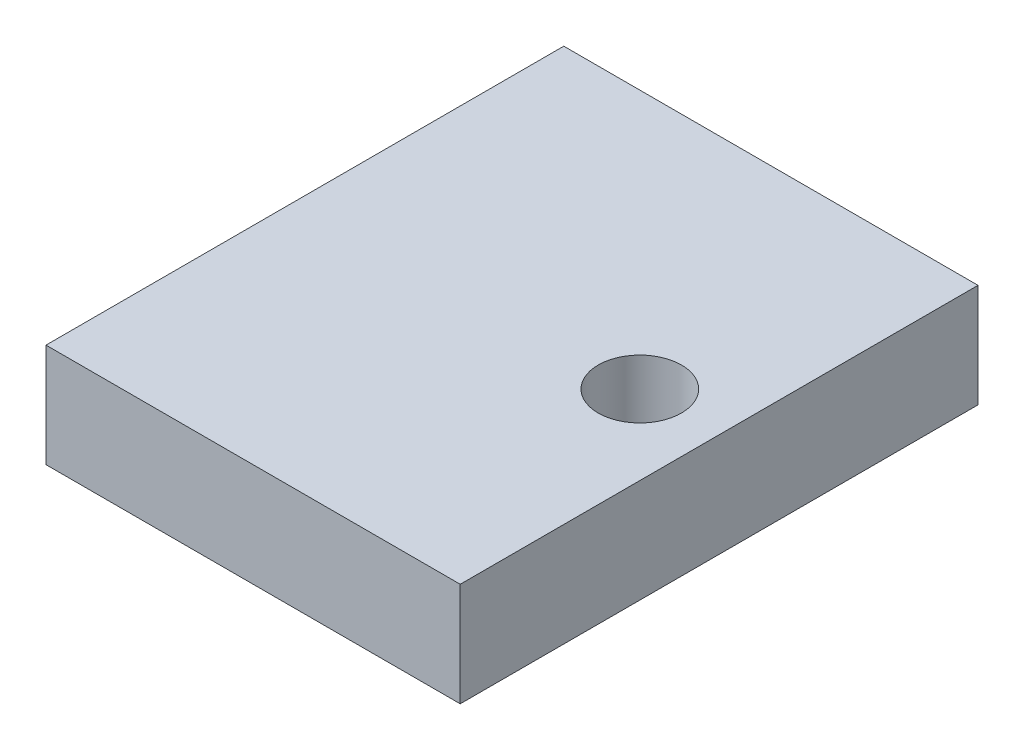
ISO-10303-21;
HEADER;
FILE_DESCRIPTION(('STEP AP214'),'2;1');
FILE_NAME('part.step','',(''),(''),'','','');
FILE_SCHEMA(('AUTOMOTIVE_DESIGN { 1 0 10303 214 1 1 1 1 }'));
ENDSEC;
DATA;
#1=APPLICATION_CONTEXT('core data for automotive mechanical design processes');
#2=APPLICATION_PROTOCOL_DEFINITION('international standard','automotive_design',2000,#1);
#3=PRODUCT_CONTEXT('',#1,'mechanical');
#4=PRODUCT('Part','Part','',(#3));
#5=PRODUCT_RELATED_PRODUCT_CATEGORY('part','',(#4));
#6=PRODUCT_DEFINITION_FORMATION('','',#4);
#7=PRODUCT_DEFINITION_CONTEXT('part definition',#1,'design');
#8=PRODUCT_DEFINITION('design','',#6,#7);
#9=PRODUCT_DEFINITION_SHAPE('','',#8);
#10=(LENGTH_UNIT() NAMED_UNIT(*) SI_UNIT(.MILLI.,.METRE.));
#11=(NAMED_UNIT(*) PLANE_ANGLE_UNIT() SI_UNIT($,.RADIAN.));
#12=(NAMED_UNIT(*) SI_UNIT($,.STERADIAN.) SOLID_ANGLE_UNIT());
#13=UNCERTAINTY_MEASURE_WITH_UNIT(LENGTH_MEASURE(1.E-05),#10,'distance_accuracy_value','');
#14=(GEOMETRIC_REPRESENTATION_CONTEXT(3) GLOBAL_UNCERTAINTY_ASSIGNED_CONTEXT((#13)) GLOBAL_UNIT_ASSIGNED_CONTEXT((#10,
#11,#12)) REPRESENTATION_CONTEXT('',''));
#15=CARTESIAN_POINT('',(0.,0.,0.));
#16=DIRECTION('',(0.,0.,1.));
#17=DIRECTION('',(1.,0.,0.));
#18=AXIS2_PLACEMENT_3D('',#15,#16,#17);
#19=CARTESIAN_POINT('',(25.4,6.35,0.));
#20=DIRECTION('',(1.,0.,0.));
#21=DIRECTION('',(0.,0.,-1.));
#22=AXIS2_PLACEMENT_3D('',#19,#20,#21);
#23=PLANE('',#22);
#24=DIRECTION('',(0.,0.,1.));
#25=VECTOR('',#24,1.);
#26=CARTESIAN_POINT('',(25.4,0.,0.));
#27=LINE('',#26,#25);
#28=CARTESIAN_POINT('',(25.4,0.,-31.75));
#29=VERTEX_POINT('',#28);
#30=CARTESIAN_POINT('',(25.4,0.,0.));
#31=VERTEX_POINT('',#30);
#32=EDGE_CURVE('E101',#29,#31,#27,.T.);
#33=ORIENTED_EDGE('',*,*,#32,.F.);
#34=DIRECTION('',(0.,-1.,0.));
#35=VECTOR('',#34,1.);
#36=CARTESIAN_POINT('',(25.4,6.35,-31.75));
#37=LINE('',#36,#35);
#38=CARTESIAN_POINT('',(25.4,6.35,-31.75));
#39=VERTEX_POINT('',#38);
#40=EDGE_CURVE('E11',#39,#29,#37,.T.);
#41=ORIENTED_EDGE('',*,*,#40,.F.);
#42=DIRECTION('',(0.,0.,1.));
#43=VECTOR('',#42,1.);
#44=CARTESIAN_POINT('',(25.4,6.35,0.));
#45=LINE('',#44,#43);
#46=CARTESIAN_POINT('',(25.4,6.35,0.));
#47=VERTEX_POINT('',#46);
#48=EDGE_CURVE('E94',#39,#47,#45,.T.);
#49=ORIENTED_EDGE('',*,*,#48,.T.);
#50=DIRECTION('',(0.,-1.,0.));
#51=VECTOR('',#50,1.);
#52=CARTESIAN_POINT('',(25.4,6.35,0.));
#53=LINE('',#52,#51);
#54=EDGE_CURVE('E75',#47,#31,#53,.T.);
#55=ORIENTED_EDGE('',*,*,#54,.T.);
#56=EDGE_LOOP('',(#33,#41,#49,#55));
#57=FACE_BOUND('',#56,.T.);
#58=ADVANCED_FACE('F36',(#57),#23,.T.);
#59=CARTESIAN_POINT('',(0.,6.35,-31.75));
#60=DIRECTION('',(0.,0.,-1.));
#61=DIRECTION('',(-1.,0.,0.));
#62=AXIS2_PLACEMENT_3D('',#59,#60,#61);
#63=PLANE('',#62);
#64=DIRECTION('',(1.,0.,0.));
#65=VECTOR('',#64,1.);
#66=CARTESIAN_POINT('',(0.,0.,-31.75));
#67=LINE('',#66,#65);
#68=CARTESIAN_POINT('',(0.,0.,-31.75));
#69=VERTEX_POINT('',#68);
#70=EDGE_CURVE('E86',#69,#29,#67,.T.);
#71=ORIENTED_EDGE('',*,*,#70,.F.);
#72=DIRECTION('',(0.,-1.,0.));
#73=VECTOR('',#72,1.);
#74=CARTESIAN_POINT('',(0.,6.35,-31.75));
#75=LINE('',#74,#73);
#76=CARTESIAN_POINT('',(0.,6.35,-31.75));
#77=VERTEX_POINT('',#76);
#78=EDGE_CURVE('E45',#77,#69,#75,.T.);
#79=ORIENTED_EDGE('',*,*,#78,.F.);
#80=DIRECTION('',(1.,0.,0.));
#81=VECTOR('',#80,1.);
#82=CARTESIAN_POINT('',(0.,6.35,-31.75));
#83=LINE('',#82,#81);
#84=EDGE_CURVE('E84',#77,#39,#83,.T.);
#85=ORIENTED_EDGE('',*,*,#84,.T.);
#86=ORIENTED_EDGE('',*,*,#40,.T.);
#87=EDGE_LOOP('',(#71,#79,#85,#86));
#88=FACE_BOUND('',#87,.T.);
#89=ADVANCED_FACE('F83',(#88),#63,.T.);
#90=CARTESIAN_POINT('',(0.,6.35,0.));
#91=DIRECTION('',(-1.,0.,0.));
#92=DIRECTION('',(0.,0.,1.));
#93=AXIS2_PLACEMENT_3D('',#90,#91,#92);
#94=PLANE('',#93);
#95=DIRECTION('',(0.,0.,-1.));
#96=VECTOR('',#95,1.);
#97=CARTESIAN_POINT('',(0.,0.,0.));
#98=LINE('',#97,#96);
#99=CARTESIAN_POINT('',(0.,0.,0.));
#100=VERTEX_POINT('',#99);
#101=EDGE_CURVE('E105',#100,#69,#98,.T.);
#102=ORIENTED_EDGE('',*,*,#101,.F.);
#103=DIRECTION('',(0.,-1.,0.));
#104=VECTOR('',#103,1.);
#105=CARTESIAN_POINT('',(0.,6.35,0.));
#106=LINE('',#105,#104);
#107=CARTESIAN_POINT('',(0.,6.35,0.));
#108=VERTEX_POINT('',#107);
#109=EDGE_CURVE('E68',#108,#100,#106,.T.);
#110=ORIENTED_EDGE('',*,*,#109,.F.);
#111=DIRECTION('',(0.,0.,-1.));
#112=VECTOR('',#111,1.);
#113=CARTESIAN_POINT('',(0.,6.35,0.));
#114=LINE('',#113,#112);
#115=EDGE_CURVE('E93',#108,#77,#114,.T.);
#116=ORIENTED_EDGE('',*,*,#115,.T.);
#117=ORIENTED_EDGE('',*,*,#78,.T.);
#118=EDGE_LOOP('',(#102,#110,#116,#117));
#119=FACE_BOUND('',#118,.T.);
#120=ADVANCED_FACE('F96',(#119),#94,.T.);
#121=CARTESIAN_POINT('',(0.,6.35,0.));
#122=DIRECTION('',(0.,0.,-1.));
#123=DIRECTION('',(-1.,0.,0.));
#124=AXIS2_PLACEMENT_3D('',#121,#122,#123);
#125=PLANE('',#124);
#126=DIRECTION('',(1.,0.,0.));
#127=VECTOR('',#126,1.);
#128=CARTESIAN_POINT('',(0.,0.,0.));
#129=LINE('',#128,#127);
#130=EDGE_CURVE('E107',#100,#31,#129,.T.);
#131=ORIENTED_EDGE('',*,*,#130,.T.);
#132=ORIENTED_EDGE('',*,*,#54,.F.);
#133=DIRECTION('',(1.,0.,0.));
#134=VECTOR('',#133,1.);
#135=CARTESIAN_POINT('',(0.,6.35,0.));
#136=LINE('',#135,#134);
#137=EDGE_CURVE('E53',#108,#47,#136,.T.);
#138=ORIENTED_EDGE('',*,*,#137,.F.);
#139=ORIENTED_EDGE('',*,*,#109,.T.);
#140=EDGE_LOOP('',(#131,#132,#138,#139));
#141=FACE_BOUND('',#140,.T.);
#142=ADVANCED_FACE('F137',(#141),#125,.F.);
#143=CARTESIAN_POINT('',(0.,6.35,0.));
#144=DIRECTION('',(0.,1.,0.));
#145=DIRECTION('',(0.,0.,1.));
#146=AXIS2_PLACEMENT_3D('',#143,#144,#145);
#147=PLANE('',#146);
#148=CARTESIAN_POINT('',(20.539202,6.35,-15.875));
#149=DIRECTION('',(0.,1.,0.));
#150=DIRECTION('',(0.,0.,1.));
#151=AXIS2_PLACEMENT_3D('',#148,#149,#150);
#152=CIRCLE('',#151,2.55269999999999);
#153=CARTESIAN_POINT('',(20.539202,6.35,-13.3223));
#154=VERTEX_POINT('',#153);
#155=EDGE_CURVE('E111',#154,#154,#152,.T.);
#156=ORIENTED_EDGE('',*,*,#155,.F.);
#157=EDGE_LOOP('',(#156));
#158=FACE_BOUND('',#157,.T.);
#159=ORIENTED_EDGE('',*,*,#48,.F.);
#160=ORIENTED_EDGE('',*,*,#84,.F.);
#161=ORIENTED_EDGE('',*,*,#115,.F.);
#162=ORIENTED_EDGE('',*,*,#137,.T.);
#163=EDGE_LOOP('',(#159,#160,#161,#162));
#164=FACE_BOUND('',#163,.T.);
#165=ADVANCED_FACE('F92',(#158,#164),#147,.T.);
#166=CARTESIAN_POINT('',(0.,0.,0.));
#167=DIRECTION('',(0.,1.,0.));
#168=DIRECTION('',(0.,0.,1.));
#169=AXIS2_PLACEMENT_3D('',#166,#167,#168);
#170=PLANE('',#169);
#171=CARTESIAN_POINT('',(20.539202,0.,-15.875));
#172=DIRECTION('',(0.,1.,0.));
#173=DIRECTION('',(0.,0.,1.));
#174=AXIS2_PLACEMENT_3D('',#171,#172,#173);
#175=CIRCLE('',#174,2.55269999999999);
#176=CARTESIAN_POINT('',(20.539202,0.,-13.3223));
#177=VERTEX_POINT('',#176);
#178=EDGE_CURVE('E39',#177,#177,#175,.T.);
#179=ORIENTED_EDGE('',*,*,#178,.T.);
#180=EDGE_LOOP('',(#179));
#181=FACE_BOUND('',#180,.T.);
#182=ORIENTED_EDGE('',*,*,#32,.T.);
#183=ORIENTED_EDGE('',*,*,#130,.F.);
#184=ORIENTED_EDGE('',*,*,#101,.T.);
#185=ORIENTED_EDGE('',*,*,#70,.T.);
#186=EDGE_LOOP('',(#182,#183,#184,#185));
#187=FACE_BOUND('',#186,.T.);
#188=ADVANCED_FACE('F118',(#181,#187),#170,.F.);
#189=CARTESIAN_POINT('',(20.539202,6.35,-15.875));
#190=DIRECTION('',(0.,1.,0.));
#191=DIRECTION('',(0.,0.,1.));
#192=AXIS2_PLACEMENT_3D('',#189,#190,#191);
#193=CYLINDRICAL_SURFACE('',#192,2.55269999999999);
#194=ORIENTED_EDGE('',*,*,#155,.T.);
#195=EDGE_LOOP('',(#194));
#196=FACE_BOUND('',#195,.T.);
#197=ORIENTED_EDGE('',*,*,#178,.F.);
#198=EDGE_LOOP('',(#197));
#199=FACE_BOUND('',#198,.T.);
#200=ADVANCED_FACE('F121',(#196,#199),#193,.F.);
#201=CLOSED_SHELL('',(#58,#89,#120,#142,#165,#188,#200));
#202=MANIFOLD_SOLID_BREP('B2',#201);
#203=ADVANCED_BREP_SHAPE_REPRESENTATION('',(#18,#202),#14);
#204=SHAPE_DEFINITION_REPRESENTATION(#9,#203);
ENDSEC;
END-ISO-10303-21;
